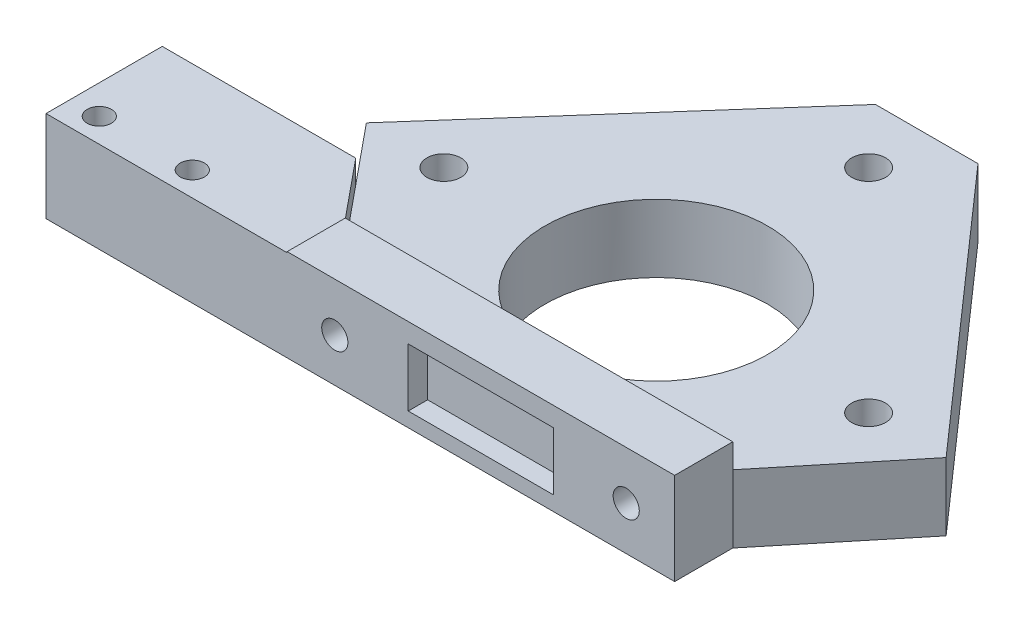
ISO-10303-21;
HEADER;
FILE_DESCRIPTION(('STEP AP214'),'2;1');
FILE_NAME('part.step','',(''),(''),'','','');
FILE_SCHEMA(('AUTOMOTIVE_DESIGN { 1 0 10303 214 1 1 1 1 }'));
ENDSEC;
DATA;
#1=APPLICATION_CONTEXT('core data for automotive mechanical design processes');
#2=APPLICATION_PROTOCOL_DEFINITION('international standard','automotive_design',2000,#1);
#3=PRODUCT_CONTEXT('',#1,'mechanical');
#4=PRODUCT('Part','Part','',(#3));
#5=PRODUCT_RELATED_PRODUCT_CATEGORY('part','',(#4));
#6=PRODUCT_DEFINITION_FORMATION('','',#4);
#7=PRODUCT_DEFINITION_CONTEXT('part definition',#1,'design');
#8=PRODUCT_DEFINITION('design','',#6,#7);
#9=PRODUCT_DEFINITION_SHAPE('','',#8);
#10=(LENGTH_UNIT() NAMED_UNIT(*) SI_UNIT(.MILLI.,.METRE.));
#11=(NAMED_UNIT(*) PLANE_ANGLE_UNIT() SI_UNIT($,.RADIAN.));
#12=(NAMED_UNIT(*) SI_UNIT($,.STERADIAN.) SOLID_ANGLE_UNIT());
#13=UNCERTAINTY_MEASURE_WITH_UNIT(LENGTH_MEASURE(1.E-05),#10,'distance_accuracy_value','');
#14=(GEOMETRIC_REPRESENTATION_CONTEXT(3) GLOBAL_UNCERTAINTY_ASSIGNED_CONTEXT((#13)) GLOBAL_UNIT_ASSIGNED_CONTEXT((#10,
#11,#12)) REPRESENTATION_CONTEXT('',''));
#15=CARTESIAN_POINT('',(0.,0.,0.));
#16=DIRECTION('',(0.,0.,1.));
#17=DIRECTION('',(1.,0.,0.));
#18=AXIS2_PLACEMENT_3D('',#15,#16,#17);
#19=CARTESIAN_POINT('',(0.,0.,6.));
#20=DIRECTION('',(0.,0.,-1.));
#21=DIRECTION('',(-1.,0.,0.));
#22=AXIS2_PLACEMENT_3D('',#19,#20,#21);
#23=PLANE('',#22);
#24=CARTESIAN_POINT('',(35.,5.,6.));
#25=DIRECTION('',(0.,0.,1.));
#26=DIRECTION('',(1.,0.,0.));
#27=AXIS2_PLACEMENT_3D('',#24,#25,#26);
#28=CIRCLE('',#27,1.35);
#29=CARTESIAN_POINT('',(36.35,5.,6.));
#30=VERTEX_POINT('',#29);
#31=EDGE_CURVE('E435',#30,#30,#28,.T.);
#32=ORIENTED_EDGE('',*,*,#31,.F.);
#33=EDGE_LOOP('',(#32));
#34=FACE_BOUND('',#33,.T.);
#35=DIRECTION('',(0.,1.,0.));
#36=VECTOR('',#35,1.);
#37=CARTESIAN_POINT('',(27.5,2.,6.));
#38=LINE('',#37,#36);
#39=CARTESIAN_POINT('',(27.5,2.,6.));
#40=VERTEX_POINT('',#39);
#41=CARTESIAN_POINT('',(27.5,8.,6.));
#42=VERTEX_POINT('',#41);
#43=EDGE_CURVE('E364',#40,#42,#38,.T.);
#44=ORIENTED_EDGE('',*,*,#43,.F.);
#45=DIRECTION('',(1.,0.,0.));
#46=VECTOR('',#45,1.);
#47=CARTESIAN_POINT('',(12.5,2.,6.));
#48=LINE('',#47,#46);
#49=CARTESIAN_POINT('',(12.5,2.,6.));
#50=VERTEX_POINT('',#49);
#51=EDGE_CURVE('E371',#50,#40,#48,.T.);
#52=ORIENTED_EDGE('',*,*,#51,.F.);
#53=DIRECTION('',(0.,-1.,0.));
#54=VECTOR('',#53,1.);
#55=CARTESIAN_POINT('',(12.5,2.,6.));
#56=LINE('',#55,#54);
#57=CARTESIAN_POINT('',(12.5,8.,6.));
#58=VERTEX_POINT('',#57);
#59=EDGE_CURVE('E368',#58,#50,#56,.T.);
#60=ORIENTED_EDGE('',*,*,#59,.F.);
#61=DIRECTION('',(-1.,0.,0.));
#62=VECTOR('',#61,1.);
#63=CARTESIAN_POINT('',(12.5,8.,6.));
#64=LINE('',#63,#62);
#65=EDGE_CURVE('E366',#42,#58,#64,.T.);
#66=ORIENTED_EDGE('',*,*,#65,.F.);
#67=EDGE_LOOP('',(#44,#52,#60,#66));
#68=FACE_BOUND('',#67,.T.);
#69=DIRECTION('',(0.,-1.,0.));
#70=VECTOR('',#69,1.);
#71=CARTESIAN_POINT('',(0.,0.,6.));
#72=LINE('',#71,#70);
#73=CARTESIAN_POINT('',(0.,10.,6.));
#74=VERTEX_POINT('',#73);
#75=CARTESIAN_POINT('',(0.,9.9,6.));
#76=VERTEX_POINT('',#75);
#77=EDGE_CURVE('E385',#74,#76,#72,.T.);
#78=ORIENTED_EDGE('',*,*,#77,.T.);
#79=DIRECTION('',(-1.,0.,0.));
#80=VECTOR('',#79,1.);
#81=CARTESIAN_POINT('',(0.,9.9,6.));
#82=LINE('',#81,#80);
#83=CARTESIAN_POINT('',(-24.8915026221292,9.9,6.));
#84=VERTEX_POINT('',#83);
#85=EDGE_CURVE('E259',#76,#84,#82,.T.);
#86=ORIENTED_EDGE('',*,*,#85,.T.);
#87=DIRECTION('',(0.,1.,0.));
#88=VECTOR('',#87,1.);
#89=CARTESIAN_POINT('',(-24.8915026221292,-31.6352723753296,6.));
#90=LINE('',#89,#88);
#91=CARTESIAN_POINT('',(-24.8915026221292,0.5,6.));
#92=VERTEX_POINT('',#91);
#93=EDGE_CURVE('E272',#92,#84,#90,.T.);
#94=ORIENTED_EDGE('',*,*,#93,.F.);
#95=DIRECTION('',(1.,0.,0.));
#96=VECTOR('',#95,1.);
#97=CARTESIAN_POINT('',(0.,0.5,6.));
#98=LINE('',#97,#96);
#99=CARTESIAN_POINT('',(40.,0.5,6.));
#100=VERTEX_POINT('',#99);
#101=EDGE_CURVE('E313',#92,#100,#98,.T.);
#102=ORIENTED_EDGE('',*,*,#101,.T.);
#103=DIRECTION('',(0.,1.,0.));
#104=VECTOR('',#103,1.);
#105=CARTESIAN_POINT('',(40.,0.,6.));
#106=LINE('',#105,#104);
#107=CARTESIAN_POINT('',(40.,10.,6.));
#108=VERTEX_POINT('',#107);
#109=EDGE_CURVE('E388',#100,#108,#106,.T.);
#110=ORIENTED_EDGE('',*,*,#109,.T.);
#111=DIRECTION('',(-1.,0.,0.));
#112=VECTOR('',#111,1.);
#113=CARTESIAN_POINT('',(0.,10.,6.));
#114=LINE('',#113,#112);
#115=EDGE_CURVE('E391',#108,#74,#114,.T.);
#116=ORIENTED_EDGE('',*,*,#115,.T.);
#117=EDGE_LOOP('',(#78,#86,#94,#102,#110,#116));
#118=FACE_BOUND('',#117,.T.);
#119=CARTESIAN_POINT('',(4.91916209096676,5.,6.));
#120=DIRECTION('',(0.,0.,1.));
#121=DIRECTION('',(1.,0.,0.));
#122=AXIS2_PLACEMENT_3D('',#119,#120,#121);
#123=CIRCLE('',#122,1.35);
#124=CARTESIAN_POINT('',(6.26916209096675,5.,6.));
#125=VERTEX_POINT('',#124);
#126=EDGE_CURVE('E122',#125,#125,#123,.T.);
#127=ORIENTED_EDGE('',*,*,#126,.F.);
#128=EDGE_LOOP('',(#127));
#129=FACE_BOUND('',#128,.T.);
#130=ADVANCED_FACE('F118',(#34,#68,#118,#129),#23,.F.);
#131=CARTESIAN_POINT('',(0.,2.5,0.));
#132=DIRECTION('',(0.773320739386146,0.,-0.634015010891118));
#133=DIRECTION('',(-0.634015010891118,0.,-0.773320739386146));
#134=AXIS2_PLACEMENT_3D('',#131,#132,#133);
#135=PLANE('',#134);
#136=DIRECTION('',(0.,1.,0.));
#137=VECTOR('',#136,1.);
#138=CARTESIAN_POINT('',(-4.91916209096675,-31.6352723753296,-6.));
#139=LINE('',#138,#137);
#140=CARTESIAN_POINT('',(-4.91916209096675,0.5,-6.));
#141=VERTEX_POINT('',#140);
#142=CARTESIAN_POINT('',(-4.91916209096675,7.5,-6.));
#143=VERTEX_POINT('',#142);
#144=EDGE_CURVE('E282',#141,#143,#139,.T.);
#145=ORIENTED_EDGE('',*,*,#144,.T.);
#146=DIRECTION('',(-0.634015010891118,0.,-0.773320739386146));
#147=VECTOR('',#146,1.);
#148=CARTESIAN_POINT('',(0.,7.5,0.));
#149=LINE('',#148,#147);
#150=CARTESIAN_POINT('',(-9.92031021678297,7.5,-12.1));
#151=VERTEX_POINT('',#150);
#152=EDGE_CURVE('E326',#143,#151,#149,.T.);
#153=ORIENTED_EDGE('',*,*,#152,.T.);
#154=DIRECTION('',(0.,1.,0.));
#155=VECTOR('',#154,1.);
#156=CARTESIAN_POINT('',(-9.92031021678297,2.5,-12.1));
#157=LINE('',#156,#155);
#158=CARTESIAN_POINT('',(-9.92031021678297,0.5,-12.1));
#159=VERTEX_POINT('',#158);
#160=EDGE_CURVE('E341',#159,#151,#157,.T.);
#161=ORIENTED_EDGE('',*,*,#160,.F.);
#162=DIRECTION('',(0.634015010891118,0.,0.773320739386146));
#163=VECTOR('',#162,1.);
#164=CARTESIAN_POINT('',(0.,0.5,0.));
#165=LINE('',#164,#163);
#166=EDGE_CURVE('E134',#159,#141,#165,.T.);
#167=ORIENTED_EDGE('',*,*,#166,.T.);
#168=EDGE_LOOP('',(#145,#153,#161,#167));
#169=FACE_BOUND('',#168,.T.);
#170=ADVANCED_FACE('F416',(#169),#135,.F.);
#171=CARTESIAN_POINT('',(0.,0.,6.));
#172=DIRECTION('',(1.,0.,0.));
#173=DIRECTION('',(0.,0.,-1.));
#174=AXIS2_PLACEMENT_3D('',#171,#172,#173);
#175=PLANE('',#174);
#176=DIRECTION('',(0.,-1.,0.));
#177=VECTOR('',#176,1.);
#178=CARTESIAN_POINT('',(0.,0.,0.));
#179=LINE('',#178,#177);
#180=CARTESIAN_POINT('',(0.,10.,0.));
#181=VERTEX_POINT('',#180);
#182=CARTESIAN_POINT('',(0.,9.9,0.));
#183=VERTEX_POINT('',#182);
#184=EDGE_CURVE('E384',#181,#183,#179,.T.);
#185=ORIENTED_EDGE('',*,*,#184,.T.);
#186=DIRECTION('',(0.,0.,1.));
#187=VECTOR('',#186,1.);
#188=CARTESIAN_POINT('',(0.,9.9,6.));
#189=LINE('',#188,#187);
#190=EDGE_CURVE('E258',#183,#76,#189,.T.);
#191=ORIENTED_EDGE('',*,*,#190,.T.);
#192=ORIENTED_EDGE('',*,*,#77,.F.);
#193=DIRECTION('',(0.,0.,-1.));
#194=VECTOR('',#193,1.);
#195=CARTESIAN_POINT('',(0.,10.,6.));
#196=LINE('',#195,#194);
#197=EDGE_CURVE('E127',#74,#181,#196,.T.);
#198=ORIENTED_EDGE('',*,*,#197,.T.);
#199=EDGE_LOOP('',(#185,#191,#192,#198));
#200=FACE_BOUND('',#199,.T.);
#201=ADVANCED_FACE('F120',(#200),#175,.F.);
#202=CARTESIAN_POINT('',(40.,0.,6.));
#203=DIRECTION('',(-1.,0.,0.));
#204=DIRECTION('',(0.,0.,1.));
#205=AXIS2_PLACEMENT_3D('',#202,#203,#204);
#206=PLANE('',#205);
#207=DIRECTION('',(0.,0.,-1.));
#208=VECTOR('',#207,1.);
#209=CARTESIAN_POINT('',(40.,0.5,6.));
#210=LINE('',#209,#208);
#211=CARTESIAN_POINT('',(40.,0.5,0.));
#212=VERTEX_POINT('',#211);
#213=EDGE_CURVE('E315',#100,#212,#210,.T.);
#214=ORIENTED_EDGE('',*,*,#213,.T.);
#215=DIRECTION('',(0.,1.,0.));
#216=VECTOR('',#215,1.);
#217=CARTESIAN_POINT('',(40.,2.5,0.));
#218=LINE('',#217,#216);
#219=CARTESIAN_POINT('',(40.,7.5,0.));
#220=VERTEX_POINT('',#219);
#221=EDGE_CURVE('E142',#212,#220,#218,.T.);
#222=ORIENTED_EDGE('',*,*,#221,.T.);
#223=DIRECTION('',(0.,1.,0.));
#224=VECTOR('',#223,1.);
#225=CARTESIAN_POINT('',(40.,0.,0.));
#226=LINE('',#225,#224);
#227=CARTESIAN_POINT('',(40.,10.,0.));
#228=VERTEX_POINT('',#227);
#229=EDGE_CURVE('E395',#220,#228,#226,.T.);
#230=ORIENTED_EDGE('',*,*,#229,.T.);
#231=DIRECTION('',(0.,0.,-1.));
#232=VECTOR('',#231,1.);
#233=CARTESIAN_POINT('',(40.,10.,6.));
#234=LINE('',#233,#232);
#235=EDGE_CURVE('E12',#108,#228,#234,.T.);
#236=ORIENTED_EDGE('',*,*,#235,.F.);
#237=ORIENTED_EDGE('',*,*,#109,.F.);
#238=EDGE_LOOP('',(#214,#222,#230,#236,#237));
#239=FACE_BOUND('',#238,.T.);
#240=ADVANCED_FACE('F478',(#239),#206,.F.);
#241=CARTESIAN_POINT('',(0.,0.,0.));
#242=DIRECTION('',(0.,0.,-1.));
#243=DIRECTION('',(-1.,0.,0.));
#244=AXIS2_PLACEMENT_3D('',#241,#242,#243);
#245=PLANE('',#244);
#246=DIRECTION('',(-1.,0.,0.));
#247=VECTOR('',#246,1.);
#248=CARTESIAN_POINT('',(0.,7.5,0.));
#249=LINE('',#248,#247);
#250=CARTESIAN_POINT('',(0.,7.5,0.));
#251=VERTEX_POINT('',#250);
#252=EDGE_CURVE('E328',#220,#251,#249,.T.);
#253=ORIENTED_EDGE('',*,*,#252,.T.);
#254=DIRECTION('',(0.,-1.,0.));
#255=VECTOR('',#254,1.);
#256=CARTESIAN_POINT('',(0.,0.,0.));
#257=LINE('',#256,#255);
#258=EDGE_CURVE('E248',#183,#251,#257,.T.);
#259=ORIENTED_EDGE('',*,*,#258,.F.);
#260=ORIENTED_EDGE('',*,*,#184,.F.);
#261=DIRECTION('',(-1.,0.,0.));
#262=VECTOR('',#261,1.);
#263=CARTESIAN_POINT('',(0.,10.,0.));
#264=LINE('',#263,#262);
#265=EDGE_CURVE('E389',#228,#181,#264,.T.);
#266=ORIENTED_EDGE('',*,*,#265,.F.);
#267=ORIENTED_EDGE('',*,*,#229,.F.);
#268=EDGE_LOOP('',(#253,#259,#260,#266,#267));
#269=FACE_BOUND('',#268,.T.);
#270=ADVANCED_FACE('F407',(#269),#245,.T.);
#271=CARTESIAN_POINT('',(0.,10.,6.));
#272=DIRECTION('',(0.,-1.,0.));
#273=DIRECTION('',(0.,0.,-1.));
#274=AXIS2_PLACEMENT_3D('',#271,#272,#273);
#275=PLANE('',#274);
#276=ORIENTED_EDGE('',*,*,#265,.T.);
#277=ORIENTED_EDGE('',*,*,#197,.F.);
#278=ORIENTED_EDGE('',*,*,#115,.F.);
#279=ORIENTED_EDGE('',*,*,#235,.T.);
#280=EDGE_LOOP('',(#276,#277,#278,#279));
#281=FACE_BOUND('',#280,.T.);
#282=ADVANCED_FACE('F477',(#281),#275,.F.);
#283=CARTESIAN_POINT('',(27.5,2.,6.));
#284=DIRECTION('',(-1.,0.,0.));
#285=DIRECTION('',(0.,0.,1.));
#286=AXIS2_PLACEMENT_3D('',#283,#284,#285);
#287=PLANE('',#286);
#288=DIRECTION('',(0.,1.,0.));
#289=VECTOR('',#288,1.);
#290=CARTESIAN_POINT('',(27.5,0.,4.));
#291=LINE('',#290,#289);
#292=CARTESIAN_POINT('',(27.5,2.,4.));
#293=VERTEX_POINT('',#292);
#294=CARTESIAN_POINT('',(27.5,8.,4.));
#295=VERTEX_POINT('',#294);
#296=EDGE_CURVE('E357',#293,#295,#291,.T.);
#297=ORIENTED_EDGE('',*,*,#296,.F.);
#298=DIRECTION('',(0.,0.,-1.));
#299=VECTOR('',#298,1.);
#300=CARTESIAN_POINT('',(27.5,2.,6.));
#301=LINE('',#300,#299);
#302=EDGE_CURVE('E373',#40,#293,#301,.T.);
#303=ORIENTED_EDGE('',*,*,#302,.F.);
#304=ORIENTED_EDGE('',*,*,#43,.T.);
#305=DIRECTION('',(0.,0.,-1.));
#306=VECTOR('',#305,1.);
#307=CARTESIAN_POINT('',(27.5,8.,6.));
#308=LINE('',#307,#306);
#309=EDGE_CURVE('E381',#42,#295,#308,.T.);
#310=ORIENTED_EDGE('',*,*,#309,.T.);
#311=EDGE_LOOP('',(#297,#303,#304,#310));
#312=FACE_BOUND('',#311,.T.);
#313=ADVANCED_FACE('F473',(#312),#287,.T.);
#314=CARTESIAN_POINT('',(12.5,8.,6.));
#315=DIRECTION('',(0.,-1.,0.));
#316=DIRECTION('',(0.,0.,-1.));
#317=AXIS2_PLACEMENT_3D('',#314,#315,#316);
#318=PLANE('',#317);
#319=DIRECTION('',(1.,0.,0.));
#320=VECTOR('',#319,1.);
#321=CARTESIAN_POINT('',(0.,8.,4.));
#322=LINE('',#321,#320);
#323=CARTESIAN_POINT('',(12.5,8.,4.));
#324=VERTEX_POINT('',#323);
#325=EDGE_CURVE('E360',#324,#295,#322,.T.);
#326=ORIENTED_EDGE('',*,*,#325,.T.);
#327=ORIENTED_EDGE('',*,*,#309,.F.);
#328=ORIENTED_EDGE('',*,*,#65,.T.);
#329=DIRECTION('',(0.,0.,-1.));
#330=VECTOR('',#329,1.);
#331=CARTESIAN_POINT('',(12.5,8.,6.));
#332=LINE('',#331,#330);
#333=EDGE_CURVE('E378',#58,#324,#332,.T.);
#334=ORIENTED_EDGE('',*,*,#333,.T.);
#335=EDGE_LOOP('',(#326,#327,#328,#334));
#336=FACE_BOUND('',#335,.T.);
#337=ADVANCED_FACE('F537',(#336),#318,.T.);
#338=CARTESIAN_POINT('',(12.5,2.,6.));
#339=DIRECTION('',(1.,0.,0.));
#340=DIRECTION('',(0.,0.,-1.));
#341=AXIS2_PLACEMENT_3D('',#338,#339,#340);
#342=PLANE('',#341);
#343=DIRECTION('',(0.,1.,0.));
#344=VECTOR('',#343,1.);
#345=CARTESIAN_POINT('',(12.5,0.,4.));
#346=LINE('',#345,#344);
#347=CARTESIAN_POINT('',(12.5,2.,4.));
#348=VERTEX_POINT('',#347);
#349=EDGE_CURVE('E362',#348,#324,#346,.T.);
#350=ORIENTED_EDGE('',*,*,#349,.T.);
#351=ORIENTED_EDGE('',*,*,#333,.F.);
#352=ORIENTED_EDGE('',*,*,#59,.T.);
#353=DIRECTION('',(0.,0.,-1.));
#354=VECTOR('',#353,1.);
#355=CARTESIAN_POINT('',(12.5,2.,6.));
#356=LINE('',#355,#354);
#357=EDGE_CURVE('E375',#50,#348,#356,.T.);
#358=ORIENTED_EDGE('',*,*,#357,.T.);
#359=EDGE_LOOP('',(#350,#351,#352,#358));
#360=FACE_BOUND('',#359,.T.);
#361=ADVANCED_FACE('F534',(#360),#342,.T.);
#362=CARTESIAN_POINT('',(12.5,2.,6.));
#363=DIRECTION('',(0.,1.,0.));
#364=DIRECTION('',(0.,0.,1.));
#365=AXIS2_PLACEMENT_3D('',#362,#363,#364);
#366=PLANE('',#365);
#367=DIRECTION('',(1.,0.,0.));
#368=VECTOR('',#367,1.);
#369=CARTESIAN_POINT('',(0.,2.,4.));
#370=LINE('',#369,#368);
#371=EDGE_CURVE('E344',#348,#293,#370,.T.);
#372=ORIENTED_EDGE('',*,*,#371,.F.);
#373=ORIENTED_EDGE('',*,*,#357,.F.);
#374=ORIENTED_EDGE('',*,*,#51,.T.);
#375=ORIENTED_EDGE('',*,*,#302,.T.);
#376=EDGE_LOOP('',(#372,#373,#374,#375));
#377=FACE_BOUND('',#376,.T.);
#378=ADVANCED_FACE('F530',(#377),#366,.T.);
#379=CARTESIAN_POINT('',(0.,0.,4.));
#380=DIRECTION('',(0.,0.,1.));
#381=DIRECTION('',(1.,0.,0.));
#382=AXIS2_PLACEMENT_3D('',#379,#380,#381);
#383=PLANE('',#382);
#384=ORIENTED_EDGE('',*,*,#371,.T.);
#385=ORIENTED_EDGE('',*,*,#296,.T.);
#386=ORIENTED_EDGE('',*,*,#325,.F.);
#387=ORIENTED_EDGE('',*,*,#349,.F.);
#388=EDGE_LOOP('',(#384,#385,#386,#387));
#389=FACE_BOUND('',#388,.T.);
#390=ADVANCED_FACE('F527',(#389),#383,.T.);
#391=CARTESIAN_POINT('',(0.,7.5,0.));
#392=DIRECTION('',(0.,1.,0.));
#393=DIRECTION('',(0.,0.,1.));
#394=AXIS2_PLACEMENT_3D('',#391,#392,#393);
#395=PLANE('',#394);
#396=DIRECTION('',(0.634015010891118,0.,0.773320739386146));
#397=VECTOR('',#396,1.);
#398=CARTESIAN_POINT('',(0.,7.5,0.));
#399=LINE('',#398,#397);
#400=EDGE_CURVE('E245',#143,#251,#399,.T.);
#401=ORIENTED_EDGE('',*,*,#400,.T.);
#402=ORIENTED_EDGE('',*,*,#252,.F.);
#403=DIRECTION('',(-0.634015010891118,0.,0.773320739386146));
#404=VECTOR('',#403,1.);
#405=CARTESIAN_POINT('',(23.9209986385894,7.5,19.6118782801694));
#406=LINE('',#405,#404);
#407=CARTESIAN_POINT('',(49.920310216783,7.5,-12.1));
#408=VERTEX_POINT('',#407);
#409=EDGE_CURVE('E330',#408,#220,#406,.T.);
#410=ORIENTED_EDGE('',*,*,#409,.F.);
#411=DIRECTION('',(0.661519537860623,0.,0.749927930556442));
#412=VECTOR('',#411,1.);
#413=CARTESIAN_POINT('',(34.0774910971681,7.5,-30.0601234378901));
#414=LINE('',#413,#412);
#415=CARTESIAN_POINT('',(25.2915026221292,7.5,-40.020310216783));
#416=VERTEX_POINT('',#415);
#417=EDGE_CURVE('E332',#416,#408,#414,.T.);
#418=ORIENTED_EDGE('',*,*,#417,.F.);
#419=DIRECTION('',(1.,0.,0.));
#420=VECTOR('',#419,1.);
#421=CARTESIAN_POINT('',(0.,7.5,-40.020310216783));
#422=LINE('',#421,#420);
#423=CARTESIAN_POINT('',(14.7084973778708,7.5,-40.020310216783));
#424=VERTEX_POINT('',#423);
#425=EDGE_CURVE('E334',#424,#416,#422,.T.);
#426=ORIENTED_EDGE('',*,*,#425,.F.);
#427=DIRECTION('',(0.661519537860623,0.,-0.749927930556442));
#428=VECTOR('',#427,1.);
#429=CARTESIAN_POINT('',(-11.5818150560214,7.5,-10.2164443158713));
#430=LINE('',#429,#428);
#431=EDGE_CURVE('E336',#151,#424,#430,.T.);
#432=ORIENTED_EDGE('',*,*,#431,.F.);
#433=ORIENTED_EDGE('',*,*,#152,.F.);
#434=EDGE_LOOP('',(#401,#402,#410,#418,#426,#432,#433));
#435=FACE_BOUND('',#434,.T.);
#436=CARTESIAN_POINT('',(41.920310216783,7.5,-12.1));
#437=DIRECTION('',(0.,1.,0.));
#438=DIRECTION('',(0.,0.,1.));
#439=AXIS2_PLACEMENT_3D('',#436,#437,#438);
#440=CIRCLE('',#439,1.75);
#441=CARTESIAN_POINT('',(41.920310216783,7.5,-10.35));
#442=VERTEX_POINT('',#441);
#443=EDGE_CURVE('E317',#442,#442,#440,.T.);
#444=ORIENTED_EDGE('',*,*,#443,.F.);
#445=EDGE_LOOP('',(#444));
#446=FACE_BOUND('',#445,.T.);
#447=CARTESIAN_POINT('',(20.,7.5,-34.020310216783));
#448=DIRECTION('',(0.,1.,0.));
#449=DIRECTION('',(0.,0.,1.));
#450=AXIS2_PLACEMENT_3D('',#447,#448,#449);
#451=CIRCLE('',#450,1.75);
#452=CARTESIAN_POINT('',(20.,7.5,-32.270310216783));
#453=VERTEX_POINT('',#452);
#454=EDGE_CURVE('E320',#453,#453,#451,.T.);
#455=ORIENTED_EDGE('',*,*,#454,.F.);
#456=EDGE_LOOP('',(#455));
#457=FACE_BOUND('',#456,.T.);
#458=CARTESIAN_POINT('',(-1.92031021678297,7.5,-12.1));
#459=DIRECTION('',(0.,1.,0.));
#460=DIRECTION('',(0.,0.,1.));
#461=AXIS2_PLACEMENT_3D('',#458,#459,#460);
#462=CIRCLE('',#461,1.75);
#463=CARTESIAN_POINT('',(-1.92031021678297,7.5,-10.35));
#464=VERTEX_POINT('',#463);
#465=EDGE_CURVE('E323',#464,#464,#462,.T.);
#466=ORIENTED_EDGE('',*,*,#465,.F.);
#467=EDGE_LOOP('',(#466));
#468=FACE_BOUND('',#467,.T.);
#469=CARTESIAN_POINT('',(20.,7.5,-12.1));
#470=DIRECTION('',(0.,1.,0.));
#471=DIRECTION('',(0.,0.,1.));
#472=AXIS2_PLACEMENT_3D('',#469,#470,#471);
#473=CIRCLE('',#472,11.5);
#474=CARTESIAN_POINT('',(20.,7.5,-0.6));
#475=VERTEX_POINT('',#474);
#476=EDGE_CURVE('E338',#475,#475,#473,.T.);
#477=ORIENTED_EDGE('',*,*,#476,.F.);
#478=EDGE_LOOP('',(#477));
#479=FACE_BOUND('',#478,.T.);
#480=ADVANCED_FACE('F411',(#435,#446,#457,#468,#479),#395,.T.);
#481=CARTESIAN_POINT('',(20.,2.5,-12.1));
#482=DIRECTION('',(0.,1.,0.));
#483=DIRECTION('',(0.,0.,1.));
#484=AXIS2_PLACEMENT_3D('',#481,#482,#483);
#485=CYLINDRICAL_SURFACE('',#484,11.5);
#486=ORIENTED_EDGE('',*,*,#476,.T.);
#487=EDGE_LOOP('',(#486));
#488=FACE_BOUND('',#487,.T.);
#489=CARTESIAN_POINT('',(20.,0.5,-12.1));
#490=DIRECTION('',(0.,-1.,0.));
#491=DIRECTION('',(0.,0.,-1.));
#492=AXIS2_PLACEMENT_3D('',#489,#490,#491);
#493=CIRCLE('',#492,11.5);
#494=CARTESIAN_POINT('',(20.,0.5,-23.6));
#495=VERTEX_POINT('',#494);
#496=EDGE_CURVE('E293',#495,#495,#493,.T.);
#497=ORIENTED_EDGE('',*,*,#496,.T.);
#498=EDGE_LOOP('',(#497));
#499=FACE_BOUND('',#498,.T.);
#500=ADVANCED_FACE('F508',(#488,#499),#485,.F.);
#501=CARTESIAN_POINT('',(41.920310216783,2.5,-12.1));
#502=DIRECTION('',(0.,1.,0.));
#503=DIRECTION('',(0.,0.,1.));
#504=AXIS2_PLACEMENT_3D('',#501,#502,#503);
#505=CYLINDRICAL_SURFACE('',#504,1.75);
#506=ORIENTED_EDGE('',*,*,#443,.T.);
#507=EDGE_LOOP('',(#506));
#508=FACE_BOUND('',#507,.T.);
#509=CARTESIAN_POINT('',(41.920310216783,0.5,-12.1));
#510=DIRECTION('',(0.,-1.,0.));
#511=DIRECTION('',(0.,0.,-1.));
#512=AXIS2_PLACEMENT_3D('',#509,#510,#511);
#513=CIRCLE('',#512,1.75);
#514=CARTESIAN_POINT('',(41.920310216783,0.5,-13.85));
#515=VERTEX_POINT('',#514);
#516=EDGE_CURVE('E310',#515,#515,#513,.T.);
#517=ORIENTED_EDGE('',*,*,#516,.T.);
#518=EDGE_LOOP('',(#517));
#519=FACE_BOUND('',#518,.T.);
#520=ADVANCED_FACE('F522',(#508,#519),#505,.F.);
#521=CARTESIAN_POINT('',(20.,2.5,-34.020310216783));
#522=DIRECTION('',(0.,1.,0.));
#523=DIRECTION('',(0.,0.,1.));
#524=AXIS2_PLACEMENT_3D('',#521,#522,#523);
#525=CYLINDRICAL_SURFACE('',#524,1.75);
#526=ORIENTED_EDGE('',*,*,#454,.T.);
#527=EDGE_LOOP('',(#526));
#528=FACE_BOUND('',#527,.T.);
#529=CARTESIAN_POINT('',(20.,0.5,-34.020310216783));
#530=DIRECTION('',(0.,-1.,0.));
#531=DIRECTION('',(0.,0.,-1.));
#532=AXIS2_PLACEMENT_3D('',#529,#530,#531);
#533=CIRCLE('',#532,1.75);
#534=CARTESIAN_POINT('',(20.,0.5,-35.770310216783));
#535=VERTEX_POINT('',#534);
#536=EDGE_CURVE('E307',#535,#535,#533,.T.);
#537=ORIENTED_EDGE('',*,*,#536,.T.);
#538=EDGE_LOOP('',(#537));
#539=FACE_BOUND('',#538,.T.);
#540=ADVANCED_FACE('F518',(#528,#539),#525,.F.);
#541=CARTESIAN_POINT('',(-1.92031021678297,2.5,-12.1));
#542=DIRECTION('',(0.,1.,0.));
#543=DIRECTION('',(0.,0.,1.));
#544=AXIS2_PLACEMENT_3D('',#541,#542,#543);
#545=CYLINDRICAL_SURFACE('',#544,1.75);
#546=ORIENTED_EDGE('',*,*,#465,.T.);
#547=EDGE_LOOP('',(#546));
#548=FACE_BOUND('',#547,.T.);
#549=CARTESIAN_POINT('',(-1.92031021678297,0.5,-12.1));
#550=DIRECTION('',(0.,-1.,0.));
#551=DIRECTION('',(0.,0.,-1.));
#552=AXIS2_PLACEMENT_3D('',#549,#550,#551);
#553=CIRCLE('',#552,1.75);
#554=CARTESIAN_POINT('',(-1.92031021678297,0.5,-13.85));
#555=VERTEX_POINT('',#554);
#556=EDGE_CURVE('E304',#555,#555,#553,.T.);
#557=ORIENTED_EDGE('',*,*,#556,.T.);
#558=EDGE_LOOP('',(#557));
#559=FACE_BOUND('',#558,.T.);
#560=ADVANCED_FACE('F514',(#548,#559),#545,.F.);
#561=CARTESIAN_POINT('',(23.9209986385894,2.5,19.6118782801694));
#562=DIRECTION('',(-0.773320739386146,0.,-0.634015010891118));
#563=DIRECTION('',(-0.634015010891118,0.,0.773320739386146));
#564=AXIS2_PLACEMENT_3D('',#561,#562,#563);
#565=PLANE('',#564);
#566=ORIENTED_EDGE('',*,*,#409,.T.);
#567=ORIENTED_EDGE('',*,*,#221,.F.);
#568=DIRECTION('',(0.634015010891118,0.,-0.773320739386146));
#569=VECTOR('',#568,1.);
#570=CARTESIAN_POINT('',(23.9209986385894,0.5,19.6118782801694));
#571=LINE('',#570,#569);
#572=CARTESIAN_POINT('',(49.920310216783,0.5,-12.1));
#573=VERTEX_POINT('',#572);
#574=EDGE_CURVE('E297',#212,#573,#571,.T.);
#575=ORIENTED_EDGE('',*,*,#574,.T.);
#576=DIRECTION('',(0.,1.,0.));
#577=VECTOR('',#576,1.);
#578=CARTESIAN_POINT('',(49.920310216783,2.5,-12.1));
#579=LINE('',#578,#577);
#580=EDGE_CURVE('E351',#573,#408,#579,.T.);
#581=ORIENTED_EDGE('',*,*,#580,.T.);
#582=EDGE_LOOP('',(#566,#567,#575,#581));
#583=FACE_BOUND('',#582,.T.);
#584=ADVANCED_FACE('F490',(#583),#565,.F.);
#585=CARTESIAN_POINT('',(34.0774910971681,2.5,-30.0601234378901));
#586=DIRECTION('',(-0.749927930556442,0.,0.661519537860623));
#587=DIRECTION('',(0.661519537860623,0.,0.749927930556442));
#588=AXIS2_PLACEMENT_3D('',#585,#586,#587);
#589=PLANE('',#588);
#590=ORIENTED_EDGE('',*,*,#417,.T.);
#591=ORIENTED_EDGE('',*,*,#580,.F.);
#592=DIRECTION('',(-0.661519537860623,0.,-0.749927930556442));
#593=VECTOR('',#592,1.);
#594=CARTESIAN_POINT('',(34.0774910971681,0.5,-30.0601234378901));
#595=LINE('',#594,#593);
#596=CARTESIAN_POINT('',(25.2915026221292,0.5,-40.020310216783));
#597=VERTEX_POINT('',#596);
#598=EDGE_CURVE('E294',#573,#597,#595,.T.);
#599=ORIENTED_EDGE('',*,*,#598,.T.);
#600=DIRECTION('',(0.,1.,0.));
#601=VECTOR('',#600,1.);
#602=CARTESIAN_POINT('',(25.2915026221292,2.5,-40.020310216783));
#603=LINE('',#602,#601);
#604=EDGE_CURVE('E348',#597,#416,#603,.T.);
#605=ORIENTED_EDGE('',*,*,#604,.T.);
#606=EDGE_LOOP('',(#590,#591,#599,#605));
#607=FACE_BOUND('',#606,.T.);
#608=ADVANCED_FACE('F493',(#607),#589,.F.);
#609=CARTESIAN_POINT('',(0.,2.5,-40.020310216783));
#610=DIRECTION('',(0.,0.,1.));
#611=DIRECTION('',(1.,0.,0.));
#612=AXIS2_PLACEMENT_3D('',#609,#610,#611);
#613=PLANE('',#612);
#614=ORIENTED_EDGE('',*,*,#425,.T.);
#615=ORIENTED_EDGE('',*,*,#604,.F.);
#616=DIRECTION('',(-1.,0.,0.));
#617=VECTOR('',#616,1.);
#618=CARTESIAN_POINT('',(0.,0.5,-40.020310216783));
#619=LINE('',#618,#617);
#620=CARTESIAN_POINT('',(14.7084973778708,0.5,-40.020310216783));
#621=VERTEX_POINT('',#620);
#622=EDGE_CURVE('E290',#597,#621,#619,.T.);
#623=ORIENTED_EDGE('',*,*,#622,.T.);
#624=DIRECTION('',(0.,1.,0.));
#625=VECTOR('',#624,1.);
#626=CARTESIAN_POINT('',(14.7084973778708,2.5,-40.020310216783));
#627=LINE('',#626,#625);
#628=EDGE_CURVE('E345',#621,#424,#627,.T.);
#629=ORIENTED_EDGE('',*,*,#628,.T.);
#630=EDGE_LOOP('',(#614,#615,#623,#629));
#631=FACE_BOUND('',#630,.T.);
#632=ADVANCED_FACE('F495',(#631),#613,.F.);
#633=CARTESIAN_POINT('',(-11.5818150560214,2.5,-10.2164443158713));
#634=DIRECTION('',(0.749927930556442,0.,0.661519537860623));
#635=DIRECTION('',(0.661519537860623,0.,-0.749927930556442));
#636=AXIS2_PLACEMENT_3D('',#633,#634,#635);
#637=PLANE('',#636);
#638=ORIENTED_EDGE('',*,*,#431,.T.);
#639=ORIENTED_EDGE('',*,*,#628,.F.);
#640=DIRECTION('',(-0.661519537860623,0.,0.749927930556442));
#641=VECTOR('',#640,1.);
#642=CARTESIAN_POINT('',(-11.5818150560214,0.5,-10.2164443158713));
#643=LINE('',#642,#641);
#644=EDGE_CURVE('E276',#621,#159,#643,.T.);
#645=ORIENTED_EDGE('',*,*,#644,.T.);
#646=ORIENTED_EDGE('',*,*,#160,.T.);
#647=EDGE_LOOP('',(#638,#639,#645,#646));
#648=FACE_BOUND('',#647,.T.);
#649=ADVANCED_FACE('F497',(#648),#637,.F.);
#650=CARTESIAN_POINT('',(0.,0.5,0.));
#651=DIRECTION('',(0.,-1.,0.));
#652=DIRECTION('',(0.,0.,-1.));
#653=AXIS2_PLACEMENT_3D('',#650,#651,#652);
#654=PLANE('',#653);
#655=ORIENTED_EDGE('',*,*,#101,.F.);
#656=DIRECTION('',(0.,0.,-1.));
#657=VECTOR('',#656,1.);
#658=CARTESIAN_POINT('',(-24.8915026221292,0.5,0.));
#659=LINE('',#658,#657);
#660=CARTESIAN_POINT('',(-24.8915026221292,0.5,-6.));
#661=VERTEX_POINT('',#660);
#662=EDGE_CURVE('E281',#92,#661,#659,.T.);
#663=ORIENTED_EDGE('',*,*,#662,.T.);
#664=DIRECTION('',(1.,0.,0.));
#665=VECTOR('',#664,1.);
#666=CARTESIAN_POINT('',(0.,0.5,-6.));
#667=LINE('',#666,#665);
#668=EDGE_CURVE('E277',#661,#141,#667,.T.);
#669=ORIENTED_EDGE('',*,*,#668,.T.);
#670=ORIENTED_EDGE('',*,*,#166,.F.);
#671=ORIENTED_EDGE('',*,*,#644,.F.);
#672=ORIENTED_EDGE('',*,*,#622,.F.);
#673=ORIENTED_EDGE('',*,*,#598,.F.);
#674=ORIENTED_EDGE('',*,*,#574,.F.);
#675=ORIENTED_EDGE('',*,*,#213,.F.);
#676=EDGE_LOOP('',(#655,#663,#669,#670,#671,#672,#673,#674,#675));
#677=FACE_BOUND('',#676,.T.);
#678=ORIENTED_EDGE('',*,*,#516,.F.);
#679=EDGE_LOOP('',(#678));
#680=FACE_BOUND('',#679,.T.);
#681=ORIENTED_EDGE('',*,*,#536,.F.);
#682=EDGE_LOOP('',(#681));
#683=FACE_BOUND('',#682,.T.);
#684=ORIENTED_EDGE('',*,*,#556,.F.);
#685=EDGE_LOOP('',(#684));
#686=FACE_BOUND('',#685,.T.);
#687=ORIENTED_EDGE('',*,*,#496,.F.);
#688=EDGE_LOOP('',(#687));
#689=FACE_BOUND('',#688,.T.);
#690=CARTESIAN_POINT('',(-21.8915026221292,0.5,3.5));
#691=DIRECTION('',(0.,-1.,0.));
#692=DIRECTION('',(0.,0.,-1.));
#693=AXIS2_PLACEMENT_3D('',#690,#691,#692);
#694=CIRCLE('',#693,1.25);
#695=CARTESIAN_POINT('',(-21.8915026221292,0.5,2.25000000000001));
#696=VERTEX_POINT('',#695);
#697=EDGE_CURVE('E273',#696,#696,#694,.F.);
#698=ORIENTED_EDGE('',*,*,#697,.T.);
#699=EDGE_LOOP('',(#698));
#700=FACE_BOUND('',#699,.T.);
#701=CARTESIAN_POINT('',(-12.2915026221292,0.5,3.5));
#702=DIRECTION('',(0.,-1.,0.));
#703=DIRECTION('',(0.,0.,-1.));
#704=AXIS2_PLACEMENT_3D('',#701,#702,#703);
#705=CIRCLE('',#704,1.25);
#706=CARTESIAN_POINT('',(-12.2915026221292,0.5,2.25));
#707=VERTEX_POINT('',#706);
#708=EDGE_CURVE('E278',#707,#707,#705,.F.);
#709=ORIENTED_EDGE('',*,*,#708,.T.);
#710=EDGE_LOOP('',(#709));
#711=FACE_BOUND('',#710,.T.);
#712=ADVANCED_FACE('F418',(#677,#680,#683,#686,#689,#700,#711),#654,.T.);
#713=CARTESIAN_POINT('',(-12.2915026221292,-31.6352723753296,3.5));
#714=DIRECTION('',(0.,1.,0.));
#715=DIRECTION('',(0.,0.,1.));
#716=AXIS2_PLACEMENT_3D('',#713,#714,#715);
#717=CYLINDRICAL_SURFACE('',#716,1.25);
#718=ORIENTED_EDGE('',*,*,#708,.F.);
#719=EDGE_LOOP('',(#718));
#720=FACE_BOUND('',#719,.T.);
#721=CARTESIAN_POINT('',(-12.2915026221292,9.9,3.5));
#722=DIRECTION('',(0.,1.,0.));
#723=DIRECTION('',(0.,0.,1.));
#724=AXIS2_PLACEMENT_3D('',#721,#722,#723);
#725=CIRCLE('',#724,1.25);
#726=CARTESIAN_POINT('',(-12.2915026221292,9.9,4.75));
#727=VERTEX_POINT('',#726);
#728=EDGE_CURVE('E268',#727,#727,#725,.T.);
#729=ORIENTED_EDGE('',*,*,#728,.T.);
#730=EDGE_LOOP('',(#729));
#731=FACE_BOUND('',#730,.T.);
#732=ADVANCED_FACE('F504',(#720,#731),#717,.F.);
#733=CARTESIAN_POINT('',(-21.8915026221292,-31.6352723753296,3.5));
#734=DIRECTION('',(0.,1.,0.));
#735=DIRECTION('',(0.,0.,1.));
#736=AXIS2_PLACEMENT_3D('',#733,#734,#735);
#737=CYLINDRICAL_SURFACE('',#736,1.25);
#738=ORIENTED_EDGE('',*,*,#697,.F.);
#739=EDGE_LOOP('',(#738));
#740=FACE_BOUND('',#739,.T.);
#741=CARTESIAN_POINT('',(-21.8915026221292,9.9,3.5));
#742=DIRECTION('',(0.,1.,0.));
#743=DIRECTION('',(0.,0.,1.));
#744=AXIS2_PLACEMENT_3D('',#741,#742,#743);
#745=CIRCLE('',#744,1.25);
#746=CARTESIAN_POINT('',(-21.8915026221292,9.9,4.75));
#747=VERTEX_POINT('',#746);
#748=EDGE_CURVE('E429',#747,#747,#745,.T.);
#749=ORIENTED_EDGE('',*,*,#748,.T.);
#750=EDGE_LOOP('',(#749));
#751=FACE_BOUND('',#750,.T.);
#752=ADVANCED_FACE('F669',(#740,#751),#737,.F.);
#753=CARTESIAN_POINT('',(0.,-31.6352723753296,-6.));
#754=DIRECTION('',(0.,0.,1.));
#755=DIRECTION('',(1.,0.,0.));
#756=AXIS2_PLACEMENT_3D('',#753,#754,#755);
#757=PLANE('',#756);
#758=ORIENTED_EDGE('',*,*,#668,.F.);
#759=DIRECTION('',(0.,1.,0.));
#760=VECTOR('',#759,1.);
#761=CARTESIAN_POINT('',(-24.8915026221292,-31.6352723753296,-6.));
#762=LINE('',#761,#760);
#763=CARTESIAN_POINT('',(-24.8915026221292,9.9,-6.));
#764=VERTEX_POINT('',#763);
#765=EDGE_CURVE('E263',#661,#764,#762,.T.);
#766=ORIENTED_EDGE('',*,*,#765,.T.);
#767=DIRECTION('',(1.,0.,0.));
#768=VECTOR('',#767,1.);
#769=CARTESIAN_POINT('',(0.,9.9,-6.));
#770=LINE('',#769,#768);
#771=CARTESIAN_POINT('',(-4.91916209096675,9.9,-6.));
#772=VERTEX_POINT('',#771);
#773=EDGE_CURVE('E255',#764,#772,#770,.T.);
#774=ORIENTED_EDGE('',*,*,#773,.T.);
#775=DIRECTION('',(0.,-1.,0.));
#776=VECTOR('',#775,1.);
#777=CARTESIAN_POINT('',(-4.91916209096675,9.9,-6.));
#778=LINE('',#777,#776);
#779=EDGE_CURVE('E238',#772,#143,#778,.T.);
#780=ORIENTED_EDGE('',*,*,#779,.T.);
#781=ORIENTED_EDGE('',*,*,#144,.F.);
#782=EDGE_LOOP('',(#758,#766,#774,#780,#781));
#783=FACE_BOUND('',#782,.T.);
#784=ADVANCED_FACE('F261',(#783),#757,.F.);
#785=CARTESIAN_POINT('',(-24.8915026221292,-31.6352723753296,0.));
#786=DIRECTION('',(1.,0.,0.));
#787=DIRECTION('',(0.,0.,-1.));
#788=AXIS2_PLACEMENT_3D('',#785,#786,#787);
#789=PLANE('',#788);
#790=ORIENTED_EDGE('',*,*,#662,.F.);
#791=ORIENTED_EDGE('',*,*,#93,.T.);
#792=DIRECTION('',(0.,0.,-1.));
#793=VECTOR('',#792,1.);
#794=CARTESIAN_POINT('',(-24.8915026221292,9.9,0.));
#795=LINE('',#794,#793);
#796=EDGE_CURVE('E249',#84,#764,#795,.T.);
#797=ORIENTED_EDGE('',*,*,#796,.T.);
#798=ORIENTED_EDGE('',*,*,#765,.F.);
#799=EDGE_LOOP('',(#790,#791,#797,#798));
#800=FACE_BOUND('',#799,.T.);
#801=ADVANCED_FACE('F425',(#800),#789,.F.);
#802=CARTESIAN_POINT('',(0.,9.9,0.));
#803=DIRECTION('',(0.,1.,0.));
#804=DIRECTION('',(0.,0.,1.));
#805=AXIS2_PLACEMENT_3D('',#802,#803,#804);
#806=PLANE('',#805);
#807=ORIENTED_EDGE('',*,*,#748,.F.);
#808=EDGE_LOOP('',(#807));
#809=FACE_BOUND('',#808,.T.);
#810=ORIENTED_EDGE('',*,*,#728,.F.);
#811=EDGE_LOOP('',(#810));
#812=FACE_BOUND('',#811,.T.);
#813=ORIENTED_EDGE('',*,*,#190,.F.);
#814=DIRECTION('',(0.634015010891118,0.,0.773320739386146));
#815=VECTOR('',#814,1.);
#816=CARTESIAN_POINT('',(0.,9.9,0.));
#817=LINE('',#816,#815);
#818=EDGE_CURVE('E242',#772,#183,#817,.T.);
#819=ORIENTED_EDGE('',*,*,#818,.F.);
#820=ORIENTED_EDGE('',*,*,#773,.F.);
#821=ORIENTED_EDGE('',*,*,#796,.F.);
#822=ORIENTED_EDGE('',*,*,#85,.F.);
#823=EDGE_LOOP('',(#813,#819,#820,#821,#822));
#824=FACE_BOUND('',#823,.T.);
#825=ADVANCED_FACE('F253',(#809,#812,#824),#806,.T.);
#826=CARTESIAN_POINT('',(0.,9.9,0.));
#827=DIRECTION('',(0.773320739386146,0.,-0.634015010891118));
#828=DIRECTION('',(-0.634015010891118,0.,-0.773320739386146));
#829=AXIS2_PLACEMENT_3D('',#826,#827,#828);
#830=PLANE('',#829);
#831=ORIENTED_EDGE('',*,*,#818,.T.);
#832=ORIENTED_EDGE('',*,*,#258,.T.);
#833=ORIENTED_EDGE('',*,*,#400,.F.);
#834=ORIENTED_EDGE('',*,*,#779,.F.);
#835=EDGE_LOOP('',(#831,#832,#833,#834));
#836=FACE_BOUND('',#835,.T.);
#837=ADVANCED_FACE('F240',(#836),#830,.T.);
#838=CARTESIAN_POINT('',(4.91916209096676,5.,-8.20877958483902));
#839=DIRECTION('',(0.,0.,1.));
#840=DIRECTION('',(1.,0.,0.));
#841=AXIS2_PLACEMENT_3D('',#838,#839,#840);
#842=CYLINDRICAL_SURFACE('',#841,1.35);
#843=ORIENTED_EDGE('',*,*,#126,.T.);
#844=EDGE_LOOP('',(#843));
#845=FACE_BOUND('',#844,.T.);
#846=CARTESIAN_POINT('',(4.91916209096676,5.,-10.));
#847=DIRECTION('',(0.,0.,1.));
#848=DIRECTION('',(1.,0.,0.));
#849=AXIS2_PLACEMENT_3D('',#846,#847,#848);
#850=CIRCLE('',#849,1.35);
#851=CARTESIAN_POINT('',(6.26916209096675,5.,-10.));
#852=VERTEX_POINT('',#851);
#853=EDGE_CURVE('E438',#852,#852,#850,.T.);
#854=ORIENTED_EDGE('',*,*,#853,.F.);
#855=EDGE_LOOP('',(#854));
#856=FACE_BOUND('',#855,.T.);
#857=ADVANCED_FACE('F447',(#845,#856),#842,.F.);
#858=CARTESIAN_POINT('',(35.,5.,-8.20877958483902));
#859=DIRECTION('',(0.,0.,1.));
#860=DIRECTION('',(1.,0.,0.));
#861=AXIS2_PLACEMENT_3D('',#858,#859,#860);
#862=CYLINDRICAL_SURFACE('',#861,1.35);
#863=ORIENTED_EDGE('',*,*,#31,.T.);
#864=EDGE_LOOP('',(#863));
#865=FACE_BOUND('',#864,.T.);
#866=CARTESIAN_POINT('',(35.,5.,-10.));
#867=DIRECTION('',(0.,0.,1.));
#868=DIRECTION('',(1.,0.,0.));
#869=AXIS2_PLACEMENT_3D('',#866,#867,#868);
#870=CIRCLE('',#869,1.35);
#871=CARTESIAN_POINT('',(36.35,5.,-10.));
#872=VERTEX_POINT('',#871);
#873=EDGE_CURVE('E439',#872,#872,#870,.T.);
#874=ORIENTED_EDGE('',*,*,#873,.F.);
#875=EDGE_LOOP('',(#874));
#876=FACE_BOUND('',#875,.T.);
#877=ADVANCED_FACE('F449',(#865,#876),#862,.F.);
#878=CARTESIAN_POINT('',(0.,0.,-10.));
#879=DIRECTION('',(0.,0.,1.));
#880=DIRECTION('',(1.,0.,0.));
#881=AXIS2_PLACEMENT_3D('',#878,#879,#880);
#882=PLANE('',#881);
#883=ORIENTED_EDGE('',*,*,#873,.T.);
#884=EDGE_LOOP('',(#883));
#885=FACE_BOUND('',#884,.T.);
#886=ADVANCED_FACE('F456',(#885),#882,.T.);
#887=CARTESIAN_POINT('',(0.,0.,-10.));
#888=DIRECTION('',(0.,0.,1.));
#889=DIRECTION('',(1.,0.,0.));
#890=AXIS2_PLACEMENT_3D('',#887,#888,#889);
#891=PLANE('',#890);
#892=ORIENTED_EDGE('',*,*,#853,.T.);
#893=EDGE_LOOP('',(#892));
#894=FACE_BOUND('',#893,.T.);
#895=ADVANCED_FACE('F445',(#894),#891,.T.);
#896=CLOSED_SHELL('',(#130,#170,#201,#240,#270,#282,#313,#337,#361,#378,#390,#480,#500,#520,
#540,#560,#584,#608,#632,#649,#712,#732,#752,#784,#801,#825,#837,#857,#877,#886,#895));
#897=MANIFOLD_SOLID_BREP('B2',#896);
#898=ADVANCED_BREP_SHAPE_REPRESENTATION('',(#18,#897),#14);
#899=SHAPE_DEFINITION_REPRESENTATION(#9,#898);
ENDSEC;
END-ISO-10303-21;
